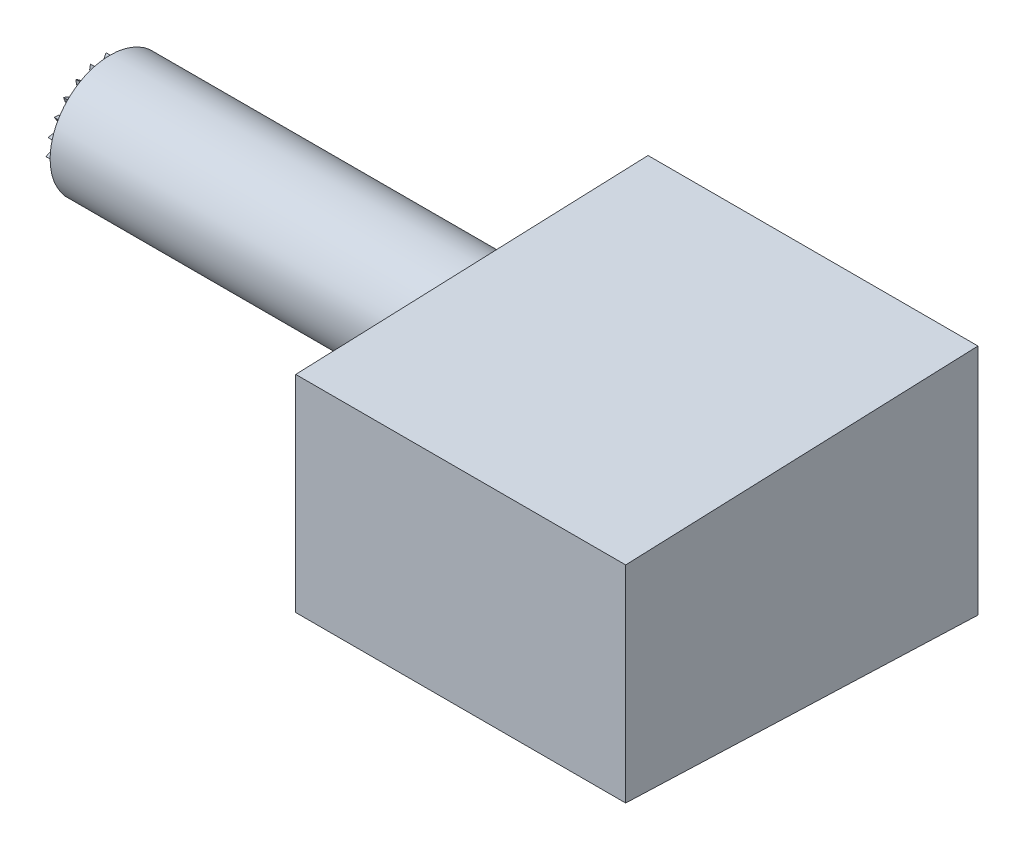
ISO-10303-21;
HEADER;
FILE_DESCRIPTION(('STEP AP214'),'2;1');
FILE_NAME('part.step','',(''),(''),'','','');
FILE_SCHEMA(('AUTOMOTIVE_DESIGN { 1 0 10303 214 1 1 1 1 }'));
ENDSEC;
DATA;
#1=APPLICATION_CONTEXT('core data for automotive mechanical design processes');
#2=APPLICATION_PROTOCOL_DEFINITION('international standard','automotive_design',2000,#1);
#3=PRODUCT_CONTEXT('',#1,'mechanical');
#4=PRODUCT('Part','Part','',(#3));
#5=PRODUCT_RELATED_PRODUCT_CATEGORY('part','',(#4));
#6=PRODUCT_DEFINITION_FORMATION('','',#4);
#7=PRODUCT_DEFINITION_CONTEXT('part definition',#1,'design');
#8=PRODUCT_DEFINITION('design','',#6,#7);
#9=PRODUCT_DEFINITION_SHAPE('','',#8);
#10=(LENGTH_UNIT() NAMED_UNIT(*) SI_UNIT(.MILLI.,.METRE.));
#11=(NAMED_UNIT(*) PLANE_ANGLE_UNIT() SI_UNIT($,.RADIAN.));
#12=(NAMED_UNIT(*) SI_UNIT($,.STERADIAN.) SOLID_ANGLE_UNIT());
#13=UNCERTAINTY_MEASURE_WITH_UNIT(LENGTH_MEASURE(1.E-05),#10,'distance_accuracy_value','');
#14=(GEOMETRIC_REPRESENTATION_CONTEXT(3) GLOBAL_UNCERTAINTY_ASSIGNED_CONTEXT((#13)) GLOBAL_UNIT_ASSIGNED_CONTEXT((#10,
#11,#12)) REPRESENTATION_CONTEXT('',''));
#15=CARTESIAN_POINT('',(0.,0.,0.));
#16=DIRECTION('',(0.,0.,1.));
#17=DIRECTION('',(1.,0.,0.));
#18=AXIS2_PLACEMENT_3D('',#15,#16,#17);
#19=CARTESIAN_POINT('',(0.,-0.0548923524131538,619.584385296464));
#20=DIRECTION('',(0.,8.85954415579071E-05,-0.999999996075424));
#21=DIRECTION('',(0.,0.999999996075424,8.85954415579071E-05));
#22=AXIS2_PLACEMENT_3D('',#19,#20,#21);
#23=PLANE('',#22);
#24=DIRECTION('',(0.,-0.999999996075424,-8.85954415579403E-05));
#25=VECTOR('',#24,1.);
#26=CARTESIAN_POINT('',(15.7387702745492,-8.30004325850316,619.583654813676));
#27=LINE('',#26,#25);
#28=CARTESIAN_POINT('',(15.7387702745492,-8.30004325850316,619.583654813676));
#29=VERTEX_POINT('',#28);
#30=CARTESIAN_POINT('',(15.7387702745492,-28.4000431796192,619.5818740453));
#31=VERTEX_POINT('',#30);
#32=EDGE_CURVE('E79',#29,#31,#27,.T.);
#33=ORIENTED_EDGE('',*,*,#32,.F.);
#34=DIRECTION('',(1.,0.,0.));
#35=VECTOR('',#34,1.);
#36=CARTESIAN_POINT('',(15.7387702745492,-8.30004325850316,619.583654813676));
#37=LINE('',#36,#35);
#38=CARTESIAN_POINT('',(-4.36122972545081,-8.30004325850316,619.583654813676));
#39=VERTEX_POINT('',#38);
#40=EDGE_CURVE('E786',#39,#29,#37,.T.);
#41=ORIENTED_EDGE('',*,*,#40,.F.);
#42=DIRECTION('',(0.,0.999999996075424,8.85954415579403E-05));
#43=VECTOR('',#42,1.);
#44=CARTESIAN_POINT('',(-4.36122972545081,-8.30004325850316,619.583654813676));
#45=LINE('',#44,#43);
#46=CARTESIAN_POINT('',(-4.36122972545081,-28.4000431796192,619.5818740453));
#47=VERTEX_POINT('',#46);
#48=EDGE_CURVE('E795',#47,#39,#45,.T.);
#49=ORIENTED_EDGE('',*,*,#48,.F.);
#50=DIRECTION('',(-1.,0.,0.));
#51=VECTOR('',#50,1.);
#52=CARTESIAN_POINT('',(15.7387702745492,-28.4000431796192,619.5818740453));
#53=LINE('',#52,#51);
#54=EDGE_CURVE('E799',#31,#47,#53,.T.);
#55=ORIENTED_EDGE('',*,*,#54,.F.);
#56=EDGE_LOOP('',(#33,#41,#49,#55));
#57=FACE_BOUND('',#56,.T.);
#58=DIRECTION('',(0.,0.999999996075424,8.85954415579071E-05));
#59=VECTOR('',#58,1.);
#60=CARTESIAN_POINT('',(-34.3112297254508,-68.3459607170805,619.578335019084));
#61=LINE('',#60,#59);
#62=CARTESIAN_POINT('',(-34.3112297254508,-46.6026752505061,619.580261375068));
#63=VERTEX_POINT('',#62);
#64=CARTESIAN_POINT('',(-34.3112297254508,9.9025888123838,619.585267483908));
#65=VERTEX_POINT('',#64);
#66=EDGE_CURVE('E498',#63,#65,#61,.T.);
#67=ORIENTED_EDGE('',*,*,#66,.T.);
#68=DIRECTION('',(1.,0.,0.));
#69=VECTOR('',#68,1.);
#70=CARTESIAN_POINT('',(-74.3112297254508,9.90258881238379,619.585267483908));
#71=LINE('',#70,#69);
#72=CARTESIAN_POINT('',(45.6887702745492,9.90258881238379,619.585267483908));
#73=VERTEX_POINT('',#72);
#74=EDGE_CURVE('E474',#65,#73,#71,.T.);
#75=ORIENTED_EDGE('',*,*,#74,.T.);
#76=DIRECTION('',(0.,-0.999999996075424,-8.85954415579071E-05));
#77=VECTOR('',#76,1.);
#78=CARTESIAN_POINT('',(45.6887702745492,31.6540384980043,619.587194563205));
#79=LINE('',#78,#77);
#80=CARTESIAN_POINT('',(45.6887702745492,-46.6026752505061,619.580261375068));
#81=VERTEX_POINT('',#80);
#82=EDGE_CURVE('E502',#73,#81,#79,.T.);
#83=ORIENTED_EDGE('',*,*,#82,.T.);
#84=DIRECTION('',(1.,0.,0.));
#85=VECTOR('',#84,1.);
#86=CARTESIAN_POINT('',(-74.3112297254508,-46.6026752505061,619.580261375068));
#87=LINE('',#86,#85);
#88=EDGE_CURVE('E485',#63,#81,#87,.T.);
#89=ORIENTED_EDGE('',*,*,#88,.F.);
#90=EDGE_LOOP('',(#67,#75,#83,#89));
#91=FACE_BOUND('',#90,.T.);
#92=ADVANCED_FACE('F61',(#57,#91),#23,.T.);
#93=CARTESIAN_POINT('',(-74.3112297254508,0.,705.));
#94=DIRECTION('',(0.,0.,-1.));
#95=DIRECTION('',(-1.,0.,0.));
#96=AXIS2_PLACEMENT_3D('',#93,#94,#95);
#97=PLANE('',#96);
#98=DIRECTION('',(1.,0.,0.));
#99=VECTOR('',#98,1.);
#100=CARTESIAN_POINT('',(-74.3112297254508,-43.3575154821235,705.));
#101=LINE('',#100,#99);
#102=CARTESIAN_POINT('',(-34.3112297254508,-43.3575154821235,705.));
#103=VERTEX_POINT('',#102);
#104=CARTESIAN_POINT('',(45.6887702745492,-43.3575154821235,705.));
#105=VERTEX_POINT('',#104);
#106=EDGE_CURVE('E487',#103,#105,#101,.T.);
#107=ORIENTED_EDGE('',*,*,#106,.T.);
#108=DIRECTION('',(0.,1.,0.));
#109=VECTOR('',#108,1.);
#110=CARTESIAN_POINT('',(45.6887702745492,0.,705.));
#111=LINE('',#110,#109);
#112=CARTESIAN_POINT('',(45.6887702745492,6.64248451787645,705.));
#113=VERTEX_POINT('',#112);
#114=EDGE_CURVE('E13',#105,#113,#111,.T.);
#115=ORIENTED_EDGE('',*,*,#114,.T.);
#116=DIRECTION('',(1.,0.,0.));
#117=VECTOR('',#116,1.);
#118=CARTESIAN_POINT('',(-74.3112297254508,6.64248451787645,705.));
#119=LINE('',#118,#117);
#120=CARTESIAN_POINT('',(-34.3112297254508,6.64248451787645,705.));
#121=VERTEX_POINT('',#120);
#122=EDGE_CURVE('E492',#121,#113,#119,.T.);
#123=ORIENTED_EDGE('',*,*,#122,.F.);
#124=DIRECTION('',(0.,1.,0.));
#125=VECTOR('',#124,1.);
#126=CARTESIAN_POINT('',(-34.3112297254508,-68.3575154821235,705.));
#127=LINE('',#126,#125);
#128=EDGE_CURVE('E482',#103,#121,#127,.T.);
#129=ORIENTED_EDGE('',*,*,#128,.F.);
#130=EDGE_LOOP('',(#107,#115,#123,#129));
#131=FACE_BOUND('',#130,.T.);
#132=ADVANCED_FACE('F534',(#131),#97,.F.);
#133=CARTESIAN_POINT('',(45.6887702745492,31.6424845178765,750.));
#134=DIRECTION('',(-1.,0.,0.));
#135=DIRECTION('',(0.,0.,1.));
#136=AXIS2_PLACEMENT_3D('',#133,#134,#135);
#137=PLANE('',#136);
#138=ORIENTED_EDGE('',*,*,#82,.F.);
#139=DIRECTION('',(0.,0.0381401679043731,-0.999272399094574));
#140=VECTOR('',#139,1.);
#141=CARTESIAN_POINT('',(45.6887702745492,33.5020759229185,1.27870518789766));
#142=LINE('',#141,#140);
#143=EDGE_CURVE('E71',#113,#73,#142,.T.);
#144=ORIENTED_EDGE('',*,*,#143,.F.);
#145=ORIENTED_EDGE('',*,*,#114,.F.);
#146=DIRECTION('',(0.,-0.0379633617237289,-0.999279131757805));
#147=VECTOR('',#146,1.);
#148=CARTESIAN_POINT('',(45.6887702745492,-70.039904475994,2.66086836421801));
#149=LINE('',#148,#147);
#150=EDGE_CURVE('E491',#105,#81,#149,.T.);
#151=ORIENTED_EDGE('',*,*,#150,.T.);
#152=EDGE_LOOP('',(#138,#144,#145,#151));
#153=FACE_BOUND('',#152,.T.);
#154=ADVANCED_FACE('F532',(#153),#137,.F.);
#155=CARTESIAN_POINT('',(-34.3112297254508,-68.3575154821235,750.));
#156=DIRECTION('',(1.,0.,0.));
#157=DIRECTION('',(0.,1.,0.));
#158=AXIS2_PLACEMENT_3D('',#155,#156,#157);
#159=PLANE('',#158);
#160=ORIENTED_EDGE('',*,*,#66,.F.);
#161=DIRECTION('',(0.,-0.0379633617237289,-0.999279131757805));
#162=VECTOR('',#161,1.);
#163=CARTESIAN_POINT('',(-34.3112297254508,-41.6864261215724,748.986745363951));
#164=LINE('',#163,#162);
#165=EDGE_CURVE('E495',#103,#63,#164,.T.);
#166=ORIENTED_EDGE('',*,*,#165,.F.);
#167=ORIENTED_EDGE('',*,*,#128,.T.);
#168=DIRECTION('',(0.,0.0381401679043731,-0.999272399094574));
#169=VECTOR('',#168,1.);
#170=CARTESIAN_POINT('',(-34.3112297254508,4.81832531852815,752.792971022926));
#171=LINE('',#170,#169);
#172=EDGE_CURVE('E65',#121,#65,#171,.T.);
#173=ORIENTED_EDGE('',*,*,#172,.T.);
#174=EDGE_LOOP('',(#160,#166,#167,#173));
#175=FACE_BOUND('',#174,.T.);
#176=CARTESIAN_POINT('',(-34.3112297254508,-18.3575154821236,650.));
#177=DIRECTION('',(-1.,0.,0.));
#178=DIRECTION('',(0.,-1.,0.));
#179=AXIS2_PLACEMENT_3D('',#176,#177,#178);
#180=CIRCLE('',#179,14.5434368372992);
#181=CARTESIAN_POINT('',(-34.3112297254508,-32.9009523194227,650.));
#182=VERTEX_POINT('',#181);
#183=EDGE_CURVE('E274',#182,#182,#180,.T.);
#184=ORIENTED_EDGE('',*,*,#183,.F.);
#185=EDGE_LOOP('',(#184));
#186=FACE_BOUND('',#185,.T.);
#187=ADVANCED_FACE('F521',(#175,#186),#159,.F.);
#188=CARTESIAN_POINT('',(-74.3112297254508,-70.039904475994,2.66086836421801));
#189=DIRECTION('',(0.,-0.999279131757805,0.0379633617237289));
#190=DIRECTION('',(0.,-0.0379633617237289,-0.999279131757805));
#191=AXIS2_PLACEMENT_3D('',#188,#189,#190);
#192=PLANE('',#191);
#193=ORIENTED_EDGE('',*,*,#165,.T.);
#194=ORIENTED_EDGE('',*,*,#88,.T.);
#195=ORIENTED_EDGE('',*,*,#150,.F.);
#196=ORIENTED_EDGE('',*,*,#106,.F.);
#197=EDGE_LOOP('',(#193,#194,#195,#196));
#198=FACE_BOUND('',#197,.T.);
#199=ADVANCED_FACE('F63',(#198),#192,.T.);
#200=CARTESIAN_POINT('',(-74.3112297254508,33.5020759229185,1.27870518789766));
#201=DIRECTION('',(0.,-0.999272399094574,-0.0381401679043731));
#202=DIRECTION('',(0.,0.0381401679043731,-0.999272399094574));
#203=AXIS2_PLACEMENT_3D('',#200,#201,#202);
#204=PLANE('',#203);
#205=ORIENTED_EDGE('',*,*,#74,.F.);
#206=ORIENTED_EDGE('',*,*,#172,.F.);
#207=ORIENTED_EDGE('',*,*,#122,.T.);
#208=ORIENTED_EDGE('',*,*,#143,.T.);
#209=EDGE_LOOP('',(#205,#206,#207,#208));
#210=FACE_BOUND('',#209,.T.);
#211=ADVANCED_FACE('F527',(#210),#204,.F.);
#212=CARTESIAN_POINT('',(15.7387702745492,-8.30181516733431,639.583654735184));
#213=DIRECTION('',(1.,0.,0.));
#214=DIRECTION('',(0.,0.,-1.));
#215=AXIS2_PLACEMENT_3D('',#212,#213,#214);
#216=PLANE('',#215);
#217=ORIENTED_EDGE('',*,*,#32,.T.);
#218=DIRECTION('',(0.,8.85954415579071E-05,-0.999999996075424));
#219=VECTOR('',#218,1.);
#220=CARTESIAN_POINT('',(15.7387702745492,-28.4018150884503,639.581873966809));
#221=LINE('',#220,#219);
#222=CARTESIAN_POINT('',(15.7387702745492,-28.4018150884503,639.581873966809));
#223=VERTEX_POINT('',#222);
#224=EDGE_CURVE('E821',#223,#31,#221,.T.);
#225=ORIENTED_EDGE('',*,*,#224,.F.);
#226=DIRECTION('',(0.,-0.999999996075424,-8.85954415579403E-05));
#227=VECTOR('',#226,1.);
#228=CARTESIAN_POINT('',(15.7387702745492,-8.30181516733431,639.583654735184));
#229=LINE('',#228,#227);
#230=CARTESIAN_POINT('',(15.7387702745492,-8.30181516733431,639.583654735184));
#231=VERTEX_POINT('',#230);
#232=EDGE_CURVE('E794',#231,#223,#229,.T.);
#233=ORIENTED_EDGE('',*,*,#232,.F.);
#234=DIRECTION('',(0.,8.85954415579071E-05,-0.999999996075424));
#235=VECTOR('',#234,1.);
#236=CARTESIAN_POINT('',(15.7387702745492,-8.30181516733431,639.583654735184));
#237=LINE('',#236,#235);
#238=EDGE_CURVE('E788',#231,#29,#237,.T.);
#239=ORIENTED_EDGE('',*,*,#238,.T.);
#240=EDGE_LOOP('',(#217,#225,#233,#239));
#241=FACE_BOUND('',#240,.T.);
#242=ADVANCED_FACE('F544',(#241),#216,.F.);
#243=CARTESIAN_POINT('',(15.7387702745492,-8.30181516733431,639.583654735184));
#244=DIRECTION('',(0.,0.999999996075424,8.85954415579071E-05));
#245=DIRECTION('',(0.,-8.85954415579071E-05,0.999999996075424));
#246=AXIS2_PLACEMENT_3D('',#243,#244,#245);
#247=PLANE('',#246);
#248=ORIENTED_EDGE('',*,*,#40,.T.);
#249=ORIENTED_EDGE('',*,*,#238,.F.);
#250=DIRECTION('',(1.,0.,0.));
#251=VECTOR('',#250,1.);
#252=CARTESIAN_POINT('',(15.7387702745492,-8.30181516733431,639.583654735184));
#253=LINE('',#252,#251);
#254=CARTESIAN_POINT('',(-4.36122972545081,-8.30181516733431,639.583654735184));
#255=VERTEX_POINT('',#254);
#256=EDGE_CURVE('E808',#255,#231,#253,.T.);
#257=ORIENTED_EDGE('',*,*,#256,.F.);
#258=DIRECTION('',(0.,8.85954415579071E-05,-0.999999996075424));
#259=VECTOR('',#258,1.);
#260=CARTESIAN_POINT('',(-4.36122972545081,-8.30181516733431,639.583654735184));
#261=LINE('',#260,#259);
#262=EDGE_CURVE('E790',#255,#39,#261,.T.);
#263=ORIENTED_EDGE('',*,*,#262,.T.);
#264=EDGE_LOOP('',(#248,#249,#257,#263));
#265=FACE_BOUND('',#264,.T.);
#266=ADVANCED_FACE('F556',(#265),#247,.F.);
#267=CARTESIAN_POINT('',(-4.36122972545081,-8.30181516733431,639.583654735184));
#268=DIRECTION('',(-1.,0.,0.));
#269=DIRECTION('',(0.,0.,1.));
#270=AXIS2_PLACEMENT_3D('',#267,#268,#269);
#271=PLANE('',#270);
#272=ORIENTED_EDGE('',*,*,#48,.T.);
#273=ORIENTED_EDGE('',*,*,#262,.F.);
#274=DIRECTION('',(0.,0.999999996075424,8.85954415579403E-05));
#275=VECTOR('',#274,1.);
#276=CARTESIAN_POINT('',(-4.36122972545081,-8.30181516733431,639.583654735184));
#277=LINE('',#276,#275);
#278=CARTESIAN_POINT('',(-4.36122972545081,-28.4018150884503,639.581873966809));
#279=VERTEX_POINT('',#278);
#280=EDGE_CURVE('E858',#279,#255,#277,.T.);
#281=ORIENTED_EDGE('',*,*,#280,.F.);
#282=DIRECTION('',(0.,8.85954415579071E-05,-0.999999996075424));
#283=VECTOR('',#282,1.);
#284=CARTESIAN_POINT('',(-4.36122972545081,-28.4018150884503,639.581873966809));
#285=LINE('',#284,#283);
#286=EDGE_CURVE('E818',#279,#47,#285,.T.);
#287=ORIENTED_EDGE('',*,*,#286,.T.);
#288=EDGE_LOOP('',(#272,#273,#281,#287));
#289=FACE_BOUND('',#288,.T.);
#290=ADVANCED_FACE('F775',(#289),#271,.F.);
#291=CARTESIAN_POINT('',(15.7387702745492,-28.4018150884503,639.581873966809));
#292=DIRECTION('',(0.,-0.999999996075424,-8.85954415579071E-05));
#293=DIRECTION('',(0.,8.85954415579071E-05,-0.999999996075424));
#294=AXIS2_PLACEMENT_3D('',#291,#292,#293);
#295=PLANE('',#294);
#296=ORIENTED_EDGE('',*,*,#54,.T.);
#297=ORIENTED_EDGE('',*,*,#286,.F.);
#298=DIRECTION('',(-1.,0.,0.));
#299=VECTOR('',#298,1.);
#300=CARTESIAN_POINT('',(15.7387702745492,-28.4018150884503,639.581873966809));
#301=LINE('',#300,#299);
#302=EDGE_CURVE('E861',#223,#279,#301,.T.);
#303=ORIENTED_EDGE('',*,*,#302,.F.);
#304=ORIENTED_EDGE('',*,*,#224,.T.);
#305=EDGE_LOOP('',(#296,#297,#303,#304));
#306=FACE_BOUND('',#305,.T.);
#307=ADVANCED_FACE('F772',(#306),#295,.F.);
#308=CARTESIAN_POINT('',(0.,-0.0566642612461121,639.584385217972));
#309=DIRECTION('',(0.,8.85954415608125E-05,-0.999999996075424));
#310=DIRECTION('',(0.,0.999999996075424,8.85954415608125E-05));
#311=AXIS2_PLACEMENT_3D('',#308,#309,#310);
#312=PLANE('',#311);
#313=ORIENTED_EDGE('',*,*,#232,.T.);
#314=ORIENTED_EDGE('',*,*,#302,.T.);
#315=ORIENTED_EDGE('',*,*,#280,.T.);
#316=ORIENTED_EDGE('',*,*,#256,.T.);
#317=EDGE_LOOP('',(#313,#314,#315,#316));
#318=FACE_BOUND('',#317,.T.);
#319=ADVANCED_FACE('F546',(#318),#312,.T.);
#320=CARTESIAN_POINT('',(-34.3112297254508,-18.3575154821236,650.));
#321=DIRECTION('',(-1.,0.,0.));
#322=DIRECTION('',(0.,-1.,0.));
#323=AXIS2_PLACEMENT_3D('',#320,#321,#322);
#324=CYLINDRICAL_SURFACE('',#323,14.5434368372992);
#325=ORIENTED_EDGE('',*,*,#183,.T.);
#326=EDGE_LOOP('',(#325));
#327=FACE_BOUND('',#326,.T.);
#328=CARTESIAN_POINT('',(-134.311229725451,-18.3575154821236,650.));
#329=DIRECTION('',(-1.,0.,0.));
#330=DIRECTION('',(0.,-1.,0.));
#331=AXIS2_PLACEMENT_3D('',#328,#329,#330);
#332=CIRCLE('',#331,14.5434368372992);
#333=CARTESIAN_POINT('',(-134.311229725451,-18.3575154821236,664.543436837299));
#334=VERTEX_POINT('',#333);
#335=CARTESIAN_POINT('',(-134.311229725451,-14.5933970473849,664.047881244151));
#336=VERTEX_POINT('',#335);
#337=EDGE_CURVE('E258',#334,#336,#332,.T.);
#338=ORIENTED_EDGE('',*,*,#337,.F.);
#339=CARTESIAN_POINT('',(-134.311229725451,-3.8140786448244,650.));
#340=VERTEX_POINT('',#339);
#341=EDGE_CURVE('E275',#340,#334,#332,.T.);
#342=ORIENTED_EDGE('',*,*,#341,.F.);
#343=CARTESIAN_POINT('',(-134.311229725451,-4.30963423797249,653.764118434739));
#344=VERTEX_POINT('',#343);
#345=EDGE_CURVE('E1041',#344,#340,#332,.T.);
#346=ORIENTED_EDGE('',*,*,#345,.F.);
#347=CARTESIAN_POINT('',(-134.311229725451,-5.76252972268804,657.271718418649));
#348=VERTEX_POINT('',#347);
#349=EDGE_CURVE('E1043',#348,#344,#332,.T.);
#350=ORIENTED_EDGE('',*,*,#349,.F.);
#351=CARTESIAN_POINT('',(-134.311229725451,-8.07375267271113,660.283762809412));
#352=VERTEX_POINT('',#351);
#353=EDGE_CURVE('E1046',#352,#348,#332,.T.);
#354=ORIENTED_EDGE('',*,*,#353,.F.);
#355=CARTESIAN_POINT('',(-134.311229725451,-11.085797063474,662.594985759435));
#356=VERTEX_POINT('',#355);
#357=EDGE_CURVE('E261',#356,#352,#332,.T.);
#358=ORIENTED_EDGE('',*,*,#357,.F.);
#359=EDGE_CURVE('E255',#336,#356,#332,.T.);
#360=ORIENTED_EDGE('',*,*,#359,.F.);
#361=EDGE_LOOP('',(#338,#342,#346,#350,#354,#358,#360));
#362=FACE_BOUND('',#361,.T.);
#363=ADVANCED_FACE('F257',(#327,#362),#324,.T.);
#364=CARTESIAN_POINT('',(-135.311229725451,0.,0.));
#365=DIRECTION('',(1.,0.,0.));
#366=DIRECTION('',(0.,0.,-1.));
#367=AXIS2_PLACEMENT_3D('',#364,#365,#366);
#368=PLANE('',#367);
#369=DIRECTION('',(0.,0.904569986548664,0.426325156934646));
#370=VECTOR('',#369,1.);
#371=CARTESIAN_POINT('',(-135.311229725451,-4.87497075010482,649.5));
#372=LINE('',#371,#370);
#373=CARTESIAN_POINT('',(-135.311229725451,-4.87497075010482,649.5));
#374=VERTEX_POINT('',#373);
#375=CARTESIAN_POINT('',(-135.311229725451,-3.81407864482445,650.));
#376=VERTEX_POINT('',#375);
#377=EDGE_CURVE('E448',#374,#376,#372,.T.);
#378=ORIENTED_EDGE('',*,*,#377,.F.);
#379=DIRECTION('',(0.,0.,1.));
#380=VECTOR('',#379,1.);
#381=CARTESIAN_POINT('',(-135.311229725451,-4.87497075010482,649.5));
#382=LINE('',#381,#380);
#383=CARTESIAN_POINT('',(-135.311229725451,-4.87497075010482,650.5));
#384=VERTEX_POINT('',#383);
#385=EDGE_CURVE('E457',#374,#384,#382,.T.);
#386=ORIENTED_EDGE('',*,*,#385,.T.);
#387=DIRECTION('',(0.,-0.9045699865487,0.426325156934568));
#388=VECTOR('',#387,1.);
#389=CARTESIAN_POINT('',(-135.311229725451,-3.81407864482445,650.));
#390=LINE('',#389,#388);
#391=EDGE_CURVE('E452',#376,#384,#390,.T.);
#392=ORIENTED_EDGE('',*,*,#391,.F.);
#393=EDGE_LOOP('',(#378,#386,#392));
#394=FACE_BOUND('',#393,.T.);
#395=ADVANCED_FACE('F600',(#394),#368,.F.);
#396=CARTESIAN_POINT('',(-135.311229725451,0.,0.));
#397=DIRECTION('',(1.,0.,0.));
#398=DIRECTION('',(0.,0.,-1.));
#399=AXIS2_PLACEMENT_3D('',#396,#397,#398);
#400=PLANE('',#399);
#401=DIRECTION('',(0.,0.763406441672316,0.645918419626823));
#402=VECTOR('',#401,1.);
#403=CARTESIAN_POINT('',(-135.311229725451,-5.20496779881777,653.006576439948));
#404=LINE('',#403,#402);
#405=CARTESIAN_POINT('',(-135.311229725451,-5.20496779881777,653.006576439948));
#406=VERTEX_POINT('',#405);
#407=CARTESIAN_POINT('',(-135.311229725451,-4.30963423797251,653.764118434739));
#408=VERTEX_POINT('',#407);
#409=EDGE_CURVE('E431',#406,#408,#404,.T.);
#410=ORIENTED_EDGE('',*,*,#409,.F.);
#411=DIRECTION('',(0.,-0.258819045102499,0.965925826289074));
#412=VECTOR('',#411,1.);
#413=CARTESIAN_POINT('',(-135.311229725451,-5.20496779881777,653.006576439948));
#414=LINE('',#413,#412);
#415=CARTESIAN_POINT('',(-135.311229725451,-5.46378684392027,653.972502266237));
#416=VERTEX_POINT('',#415);
#417=EDGE_CURVE('E418',#406,#416,#414,.T.);
#418=ORIENTED_EDGE('',*,*,#417,.T.);
#419=DIRECTION('',(0.,-0.984088581714332,0.177678539332906));
#420=VECTOR('',#419,1.);
#421=CARTESIAN_POINT('',(-135.311229725451,-4.30963423797251,653.764118434739));
#422=LINE('',#421,#420);
#423=EDGE_CURVE('E441',#408,#416,#422,.T.);
#424=ORIENTED_EDGE('',*,*,#423,.F.);
#425=EDGE_LOOP('',(#410,#418,#424));
#426=FACE_BOUND('',#425,.T.);
#427=ADVANCED_FACE('F741',(#426),#400,.F.);
#428=CARTESIAN_POINT('',(-135.311229725451,0.,0.));
#429=DIRECTION('',(1.,0.,0.));
#430=DIRECTION('',(0.,0.,-1.));
#431=AXIS2_PLACEMENT_3D('',#428,#429,#430);
#432=PLANE('',#431);
#433=DIRECTION('',(0.,0.570218009384797,0.821493409452102));
#434=VECTOR('',#433,1.);
#435=CARTESIAN_POINT('',(-135.311229725451,-6.43128923653538,656.308259664117));
#436=LINE('',#435,#434);
#437=CARTESIAN_POINT('',(-135.311229725451,-6.43128923653538,656.308259664117));
#438=VERTEX_POINT('',#437);
#439=CARTESIAN_POINT('',(-135.311229725451,-5.76252972268823,657.271718418649));
#440=VERTEX_POINT('',#439);
#441=EDGE_CURVE('E397',#438,#440,#436,.T.);
#442=ORIENTED_EDGE('',*,*,#441,.F.);
#443=DIRECTION('',(0.,-0.50000000000004,0.866025403784415));
#444=VECTOR('',#443,1.);
#445=CARTESIAN_POINT('',(-135.311229725451,-6.43128923653538,656.308259664117));
#446=LINE('',#445,#444);
#447=CARTESIAN_POINT('',(-135.311229725451,-6.93128923653544,657.174285067901));
#448=VERTEX_POINT('',#447);
#449=EDGE_CURVE('E384',#438,#448,#446,.T.);
#450=ORIENTED_EDGE('',*,*,#449,.T.);
#451=DIRECTION('',(0.,-0.99654316631941,-0.0830765770965794));
#452=VECTOR('',#451,1.);
#453=CARTESIAN_POINT('',(-135.311229725451,-5.76252972268823,657.271718418649));
#454=LINE('',#453,#452);
#455=EDGE_CURVE('E407',#440,#448,#454,.T.);
#456=ORIENTED_EDGE('',*,*,#455,.F.);
#457=EDGE_LOOP('',(#442,#450,#456));
#458=FACE_BOUND('',#457,.T.);
#459=ADVANCED_FACE('F744',(#458),#432,.F.);
#460=CARTESIAN_POINT('',(-135.311229725451,0.,0.));
#461=DIRECTION('',(1.,0.,0.));
#462=DIRECTION('',(0.,0.,-1.));
#463=AXIS2_PLACEMENT_3D('',#460,#461,#462);
#464=PLANE('',#463);
#465=DIRECTION('',(0.,0.338170162087455,0.941084981005299));
#466=VECTOR('',#465,1.);
#467=CARTESIAN_POINT('',(-135.311229725451,-8.470363283869,659.180045417068));
#468=LINE('',#467,#466);
#469=CARTESIAN_POINT('',(-135.311229725451,-8.470363283869,659.180045417068));
#470=VERTEX_POINT('',#469);
#471=CARTESIAN_POINT('',(-135.311229725451,-8.0737526727113,660.283762809412));
#472=VERTEX_POINT('',#471);
#473=EDGE_CURVE('E363',#470,#472,#468,.T.);
#474=ORIENTED_EDGE('',*,*,#473,.F.);
#475=DIRECTION('',(0.,-0.707106781186548,0.707106781186548));
#476=VECTOR('',#475,1.);
#477=CARTESIAN_POINT('',(-135.311229725451,-8.470363283869,659.180045417068));
#478=LINE('',#477,#476);
#479=CARTESIAN_POINT('',(-135.311229725451,-9.17747006505557,659.887152198255));
#480=VERTEX_POINT('',#479);
#481=EDGE_CURVE('E350',#470,#480,#478,.T.);
#482=ORIENTED_EDGE('',*,*,#481,.T.);
#483=DIRECTION('',(0.,-0.941084981005258,-0.338170162087569));
#484=VECTOR('',#483,1.);
#485=CARTESIAN_POINT('',(-135.311229725451,-8.0737526727113,660.283762809412));
#486=LINE('',#485,#484);
#487=EDGE_CURVE('E373',#472,#480,#486,.T.);
#488=ORIENTED_EDGE('',*,*,#487,.F.);
#489=EDGE_LOOP('',(#474,#482,#488));
#490=FACE_BOUND('',#489,.T.);
#491=ADVANCED_FACE('F749',(#490),#464,.F.);
#492=CARTESIAN_POINT('',(-135.311229725451,0.,0.));
#493=DIRECTION('',(1.,0.,0.));
#494=DIRECTION('',(0.,0.,-1.));
#495=AXIS2_PLACEMENT_3D('',#492,#493,#494);
#496=PLANE('',#495);
#497=DIRECTION('',(0.,0.0830765770965794,0.99654316631941));
#498=VECTOR('',#497,1.);
#499=CARTESIAN_POINT('',(-135.311229725451,-11.1832304142221,661.426226245588));
#500=LINE('',#499,#498);
#501=CARTESIAN_POINT('',(-135.311229725451,-11.1832304142221,661.426226245588));
#502=VERTEX_POINT('',#501);
#503=CARTESIAN_POINT('',(-135.311229725451,-11.0857970634741,662.594985759435));
#504=VERTEX_POINT('',#503);
#505=EDGE_CURVE('E330',#502,#504,#500,.T.);
#506=ORIENTED_EDGE('',*,*,#505,.F.);
#507=DIRECTION('',(0.,-0.866025403784464,0.499999999999957));
#508=VECTOR('',#507,1.);
#509=CARTESIAN_POINT('',(-135.311229725451,-11.1832304142221,661.426226245588));
#510=LINE('',#509,#508);
#511=CARTESIAN_POINT('',(-135.311229725451,-12.0492558180065,661.926226245588));
#512=VERTEX_POINT('',#511);
#513=EDGE_CURVE('E317',#502,#512,#510,.T.);
#514=ORIENTED_EDGE('',*,*,#513,.T.);
#515=DIRECTION('',(0.,-0.821493409452058,-0.570218009384861));
#516=VECTOR('',#515,1.);
#517=CARTESIAN_POINT('',(-135.311229725451,-11.0857970634741,662.594985759435));
#518=LINE('',#517,#516);
#519=EDGE_CURVE('E339',#504,#512,#518,.T.);
#520=ORIENTED_EDGE('',*,*,#519,.F.);
#521=EDGE_LOOP('',(#506,#514,#520));
#522=FACE_BOUND('',#521,.T.);
#523=ADVANCED_FACE('F754',(#522),#496,.F.);
#524=CARTESIAN_POINT('',(-135.311229725451,0.,0.));
#525=DIRECTION('',(1.,0.,0.));
#526=DIRECTION('',(0.,0.,-1.));
#527=AXIS2_PLACEMENT_3D('',#524,#525,#526);
#528=PLANE('',#527);
#529=DIRECTION('',(0.,-0.177678539332929,0.984088581714328));
#530=VECTOR('',#529,1.);
#531=CARTESIAN_POINT('',(-135.311229725451,-14.385013215886,662.893728638203));
#532=LINE('',#531,#530);
#533=CARTESIAN_POINT('',(-135.311229725451,-14.385013215886,662.893728638203));
#534=VERTEX_POINT('',#533);
#535=CARTESIAN_POINT('',(-135.311229725451,-14.593397047385,664.047881244151));
#536=VERTEX_POINT('',#535);
#537=EDGE_CURVE('E290',#534,#536,#532,.T.);
#538=ORIENTED_EDGE('',*,*,#537,.F.);
#539=DIRECTION('',(0.,-0.965925826289072,0.258819045102506));
#540=VECTOR('',#539,1.);
#541=CARTESIAN_POINT('',(-135.311229725451,-14.385013215886,662.893728638203));
#542=LINE('',#541,#540);
#543=CARTESIAN_POINT('',(-135.311229725451,-15.350939042175,663.152547683306));
#544=VERTEX_POINT('',#543);
#545=EDGE_CURVE('E295',#534,#544,#542,.T.);
#546=ORIENTED_EDGE('',*,*,#545,.T.);
#547=DIRECTION('',(0.,-0.645918419626796,-0.763406441672339));
#548=VECTOR('',#547,1.);
#549=CARTESIAN_POINT('',(-135.311229725451,-14.593397047385,664.047881244151));
#550=LINE('',#549,#548);
#551=EDGE_CURVE('E308',#536,#544,#550,.T.);
#552=ORIENTED_EDGE('',*,*,#551,.F.);
#553=EDGE_LOOP('',(#538,#546,#552));
#554=FACE_BOUND('',#553,.T.);
#555=ADVANCED_FACE('F759',(#554),#528,.F.);
#556=CARTESIAN_POINT('',(-135.311229725451,0.,0.));
#557=DIRECTION('',(1.,0.,0.));
#558=DIRECTION('',(0.,0.,-1.));
#559=AXIS2_PLACEMENT_3D('',#556,#557,#558);
#560=PLANE('',#559);
#561=DIRECTION('',(0.,-0.426325156934607,0.904569986548682));
#562=VECTOR('',#561,1.);
#563=CARTESIAN_POINT('',(-135.311229725451,-17.8575154821236,663.482544732018));
#564=LINE('',#563,#562);
#565=CARTESIAN_POINT('',(-135.311229725451,-17.8575154821236,663.482544732018));
#566=VERTEX_POINT('',#565);
#567=CARTESIAN_POINT('',(-135.311229725451,-18.3575154821236,664.543436837299));
#568=VERTEX_POINT('',#567);
#569=EDGE_CURVE('E837',#566,#568,#564,.T.);
#570=ORIENTED_EDGE('',*,*,#569,.F.);
#571=DIRECTION('',(0.,-1.,0.));
#572=VECTOR('',#571,1.);
#573=CARTESIAN_POINT('',(-135.311229725451,-17.8575154821236,663.482544732018));
#574=LINE('',#573,#572);
#575=CARTESIAN_POINT('',(-135.311229725451,-18.8575154821236,663.482544732018));
#576=VERTEX_POINT('',#575);
#577=EDGE_CURVE('E827',#566,#576,#574,.T.);
#578=ORIENTED_EDGE('',*,*,#577,.T.);
#579=DIRECTION('',(0.,-0.426325156934607,-0.904569986548682));
#580=VECTOR('',#579,1.);
#581=CARTESIAN_POINT('',(-135.311229725451,-18.3575154821236,664.543436837299));
#582=LINE('',#581,#580);
#583=EDGE_CURVE('E845',#568,#576,#582,.T.);
#584=ORIENTED_EDGE('',*,*,#583,.F.);
#585=EDGE_LOOP('',(#570,#578,#584));
#586=FACE_BOUND('',#585,.T.);
#587=ADVANCED_FACE('F764',(#586),#560,.F.);
#588=CARTESIAN_POINT('',(-135.311229725451,-17.8575154821236,663.482544732018));
#589=DIRECTION('',(0.,0.,1.));
#590=DIRECTION('',(1.,0.,0.));
#591=AXIS2_PLACEMENT_3D('',#588,#589,#590);
#592=PLANE('',#591);
#593=DIRECTION('',(0.,-1.,0.));
#594=VECTOR('',#593,1.);
#595=CARTESIAN_POINT('',(-134.311229725451,-17.8575154821236,663.482544732018));
#596=LINE('',#595,#594);
#597=CARTESIAN_POINT('',(-134.311229725451,-17.8575154821236,663.482544732018));
#598=VERTEX_POINT('',#597);
#599=CARTESIAN_POINT('',(-134.311229725451,-18.8575154821236,663.482544732018));
#600=VERTEX_POINT('',#599);
#601=EDGE_CURVE('E87',#598,#600,#596,.T.);
#602=ORIENTED_EDGE('',*,*,#601,.T.);
#603=DIRECTION('',(1.,0.,0.));
#604=VECTOR('',#603,1.);
#605=CARTESIAN_POINT('',(-135.311229725451,-18.8575154821236,663.482544732018));
#606=LINE('',#605,#604);
#607=EDGE_CURVE('E828',#576,#600,#606,.T.);
#608=ORIENTED_EDGE('',*,*,#607,.F.);
#609=ORIENTED_EDGE('',*,*,#577,.F.);
#610=DIRECTION('',(1.,0.,0.));
#611=VECTOR('',#610,1.);
#612=CARTESIAN_POINT('',(-135.311229725451,-17.8575154821236,663.482544732018));
#613=LINE('',#612,#611);
#614=EDGE_CURVE('E815',#566,#598,#613,.T.);
#615=ORIENTED_EDGE('',*,*,#614,.T.);
#616=EDGE_LOOP('',(#602,#608,#609,#615));
#617=FACE_BOUND('',#616,.T.);
#618=ADVANCED_FACE('F612',(#617),#592,.F.);
#619=CARTESIAN_POINT('',(-135.311229725451,-18.3575154821236,664.543436837299));
#620=DIRECTION('',(0.,-0.904569986548682,0.426325156934607));
#621=DIRECTION('',(0.,-0.426325156934607,-0.904569986548682));
#622=AXIS2_PLACEMENT_3D('',#619,#620,#621);
#623=PLANE('',#622);
#624=DIRECTION('',(0.,-0.426325156934607,-0.904569986548682));
#625=VECTOR('',#624,1.);
#626=CARTESIAN_POINT('',(-134.311229725451,-18.3575154821236,664.543436837299));
#627=LINE('',#626,#625);
#628=EDGE_CURVE('E836',#334,#600,#627,.T.);
#629=ORIENTED_EDGE('',*,*,#628,.F.);
#630=DIRECTION('',(1.,0.,0.));
#631=VECTOR('',#630,1.);
#632=CARTESIAN_POINT('',(-135.311229725451,-18.3575154821236,664.543436837299));
#633=LINE('',#632,#631);
#634=EDGE_CURVE('E824',#568,#334,#633,.T.);
#635=ORIENTED_EDGE('',*,*,#634,.F.);
#636=ORIENTED_EDGE('',*,*,#583,.T.);
#637=ORIENTED_EDGE('',*,*,#607,.T.);
#638=EDGE_LOOP('',(#629,#635,#636,#637));
#639=FACE_BOUND('',#638,.T.);
#640=ADVANCED_FACE('F607',(#639),#623,.T.);
#641=CARTESIAN_POINT('',(-135.311229725451,-4.87497075010482,649.5));
#642=DIRECTION('',(0.,0.426325156934646,-0.904569986548664));
#643=DIRECTION('',(0.,0.904569986548664,0.426325156934646));
#644=AXIS2_PLACEMENT_3D('',#641,#642,#643);
#645=PLANE('',#644);
#646=DIRECTION('',(0.,0.904569986548664,0.426325156934646));
#647=VECTOR('',#646,1.);
#648=CARTESIAN_POINT('',(-134.311229725451,-4.87497075010482,649.5));
#649=LINE('',#648,#647);
#650=CARTESIAN_POINT('',(-134.311229725451,-4.87497075010482,649.5));
#651=VERTEX_POINT('',#650);
#652=EDGE_CURVE('E438',#651,#340,#649,.T.);
#653=ORIENTED_EDGE('',*,*,#652,.F.);
#654=DIRECTION('',(1.,0.,0.));
#655=VECTOR('',#654,1.);
#656=CARTESIAN_POINT('',(-135.311229725451,-4.87497075010482,649.5));
#657=LINE('',#656,#655);
#658=EDGE_CURVE('E470',#374,#651,#657,.T.);
#659=ORIENTED_EDGE('',*,*,#658,.F.);
#660=ORIENTED_EDGE('',*,*,#377,.T.);
#661=DIRECTION('',(1.,0.,0.));
#662=VECTOR('',#661,1.);
#663=CARTESIAN_POINT('',(-135.311229725451,-3.81407864482445,650.));
#664=LINE('',#663,#662);
#665=EDGE_CURVE('E460',#376,#340,#664,.T.);
#666=ORIENTED_EDGE('',*,*,#665,.T.);
#667=EDGE_LOOP('',(#653,#659,#660,#666));
#668=FACE_BOUND('',#667,.T.);
#669=ADVANCED_FACE('F611',(#668),#645,.T.);
#670=CARTESIAN_POINT('',(-135.311229725451,-4.87497075010482,649.5));
#671=DIRECTION('',(0.,1.,0.));
#672=DIRECTION('',(-1.,0.,0.));
#673=AXIS2_PLACEMENT_3D('',#670,#671,#672);
#674=PLANE('',#673);
#675=DIRECTION('',(0.,0.,1.));
#676=VECTOR('',#675,1.);
#677=CARTESIAN_POINT('',(-134.311229725451,-4.87497075010482,649.5));
#678=LINE('',#677,#676);
#679=CARTESIAN_POINT('',(-134.311229725451,-4.87497075010482,650.5));
#680=VERTEX_POINT('',#679);
#681=EDGE_CURVE('E453',#651,#680,#678,.T.);
#682=ORIENTED_EDGE('',*,*,#681,.T.);
#683=DIRECTION('',(1.,0.,0.));
#684=VECTOR('',#683,1.);
#685=CARTESIAN_POINT('',(-135.311229725451,-4.87497075010482,650.5));
#686=LINE('',#685,#684);
#687=EDGE_CURVE('E475',#384,#680,#686,.T.);
#688=ORIENTED_EDGE('',*,*,#687,.F.);
#689=ORIENTED_EDGE('',*,*,#385,.F.);
#690=ORIENTED_EDGE('',*,*,#658,.T.);
#691=EDGE_LOOP('',(#682,#688,#689,#690));
#692=FACE_BOUND('',#691,.T.);
#693=ADVANCED_FACE('F622',(#692),#674,.F.);
#694=CARTESIAN_POINT('',(-135.311229725451,-3.81407864482445,650.));
#695=DIRECTION('',(0.,0.426325156934568,0.9045699865487));
#696=DIRECTION('',(0.,-0.9045699865487,0.426325156934568));
#697=AXIS2_PLACEMENT_3D('',#694,#695,#696);
#698=PLANE('',#697);
#699=DIRECTION('',(0.,-0.9045699865487,0.426325156934568));
#700=VECTOR('',#699,1.);
#701=CARTESIAN_POINT('',(-134.311229725451,-3.81407864482445,650.));
#702=LINE('',#701,#700);
#703=EDGE_CURVE('E464',#340,#680,#702,.T.);
#704=ORIENTED_EDGE('',*,*,#703,.F.);
#705=ORIENTED_EDGE('',*,*,#665,.F.);
#706=ORIENTED_EDGE('',*,*,#391,.T.);
#707=ORIENTED_EDGE('',*,*,#687,.T.);
#708=EDGE_LOOP('',(#704,#705,#706,#707));
#709=FACE_BOUND('',#708,.T.);
#710=ADVANCED_FACE('F629',(#709),#698,.T.);
#711=CARTESIAN_POINT('',(-135.311229725451,-5.20496779881777,653.006576439948));
#712=DIRECTION('',(0.,0.645918419626823,-0.763406441672316));
#713=DIRECTION('',(0.,0.763406441672316,0.645918419626823));
#714=AXIS2_PLACEMENT_3D('',#711,#712,#713);
#715=PLANE('',#714);
#716=DIRECTION('',(0.,0.763406441672316,0.645918419626823));
#717=VECTOR('',#716,1.);
#718=CARTESIAN_POINT('',(-134.311229725451,-5.20496779881777,653.006576439948));
#719=LINE('',#718,#717);
#720=CARTESIAN_POINT('',(-134.311229725451,-5.20496779881776,653.006576439948));
#721=VERTEX_POINT('',#720);
#722=EDGE_CURVE('E434',#721,#344,#719,.T.);
#723=ORIENTED_EDGE('',*,*,#722,.F.);
#724=DIRECTION('',(1.,0.,0.));
#725=VECTOR('',#724,1.);
#726=CARTESIAN_POINT('',(-135.311229725451,-5.20496779881777,653.006576439948));
#727=LINE('',#726,#725);
#728=EDGE_CURVE('E404',#406,#721,#727,.T.);
#729=ORIENTED_EDGE('',*,*,#728,.F.);
#730=ORIENTED_EDGE('',*,*,#409,.T.);
#731=DIRECTION('',(1.,0.,0.));
#732=VECTOR('',#731,1.);
#733=CARTESIAN_POINT('',(-135.311229725451,-4.30963423797251,653.764118434739));
#734=LINE('',#733,#732);
#735=EDGE_CURVE('E414',#408,#344,#734,.T.);
#736=ORIENTED_EDGE('',*,*,#735,.T.);
#737=EDGE_LOOP('',(#723,#729,#730,#736));
#738=FACE_BOUND('',#737,.T.);
#739=ADVANCED_FACE('F633',(#738),#715,.T.);
#740=CARTESIAN_POINT('',(-135.311229725451,-5.20496779881777,653.006576439948));
#741=DIRECTION('',(0.,0.965925826289074,0.258819045102499));
#742=DIRECTION('',(0.,-0.258819045102499,0.965925826289074));
#743=AXIS2_PLACEMENT_3D('',#740,#741,#742);
#744=PLANE('',#743);
#745=DIRECTION('',(0.,-0.258819045102499,0.965925826289074));
#746=VECTOR('',#745,1.);
#747=CARTESIAN_POINT('',(-134.311229725451,-5.20496779881777,653.006576439948));
#748=LINE('',#747,#746);
#749=CARTESIAN_POINT('',(-134.311229725451,-5.46378684392027,653.972502266237));
#750=VERTEX_POINT('',#749);
#751=EDGE_CURVE('E426',#721,#750,#748,.T.);
#752=ORIENTED_EDGE('',*,*,#751,.T.);
#753=DIRECTION('',(1.,0.,0.));
#754=VECTOR('',#753,1.);
#755=CARTESIAN_POINT('',(-135.311229725451,-5.46378684392027,653.972502266237));
#756=LINE('',#755,#754);
#757=EDGE_CURVE('E419',#416,#750,#756,.T.);
#758=ORIENTED_EDGE('',*,*,#757,.F.);
#759=ORIENTED_EDGE('',*,*,#417,.F.);
#760=ORIENTED_EDGE('',*,*,#728,.T.);
#761=EDGE_LOOP('',(#752,#758,#759,#760));
#762=FACE_BOUND('',#761,.T.);
#763=ADVANCED_FACE('F642',(#762),#744,.F.);
#764=CARTESIAN_POINT('',(-135.311229725451,-4.30963423797251,653.764118434739));
#765=DIRECTION('',(0.,0.177678539332906,0.984088581714332));
#766=DIRECTION('',(0.,-0.984088581714332,0.177678539332906));
#767=AXIS2_PLACEMENT_3D('',#764,#765,#766);
#768=PLANE('',#767);
#769=DIRECTION('',(0.,-0.984088581714332,0.177678539332906));
#770=VECTOR('',#769,1.);
#771=CARTESIAN_POINT('',(-134.311229725451,-4.30963423797251,653.764118434739));
#772=LINE('',#771,#770);
#773=EDGE_CURVE('E430',#344,#750,#772,.T.);
#774=ORIENTED_EDGE('',*,*,#773,.F.);
#775=ORIENTED_EDGE('',*,*,#735,.F.);
#776=ORIENTED_EDGE('',*,*,#423,.T.);
#777=ORIENTED_EDGE('',*,*,#757,.T.);
#778=EDGE_LOOP('',(#774,#775,#776,#777));
#779=FACE_BOUND('',#778,.T.);
#780=ADVANCED_FACE('F648',(#779),#768,.T.);
#781=CARTESIAN_POINT('',(-135.311229725451,-6.43128923653538,656.308259664117));
#782=DIRECTION('',(0.,0.821493409452102,-0.570218009384797));
#783=DIRECTION('',(0.,0.570218009384797,0.821493409452102));
#784=AXIS2_PLACEMENT_3D('',#781,#782,#783);
#785=PLANE('',#784);
#786=DIRECTION('',(0.,0.570218009384797,0.821493409452102));
#787=VECTOR('',#786,1.);
#788=CARTESIAN_POINT('',(-134.311229725451,-6.43128923653538,656.308259664117));
#789=LINE('',#788,#787);
#790=CARTESIAN_POINT('',(-134.311229725451,-6.43128923653536,656.308259664117));
#791=VERTEX_POINT('',#790);
#792=EDGE_CURVE('E400',#791,#348,#789,.T.);
#793=ORIENTED_EDGE('',*,*,#792,.F.);
#794=DIRECTION('',(1.,0.,0.));
#795=VECTOR('',#794,1.);
#796=CARTESIAN_POINT('',(-135.311229725451,-6.43128923653538,656.308259664117));
#797=LINE('',#796,#795);
#798=EDGE_CURVE('E370',#438,#791,#797,.T.);
#799=ORIENTED_EDGE('',*,*,#798,.F.);
#800=ORIENTED_EDGE('',*,*,#441,.T.);
#801=DIRECTION('',(1.,0.,0.));
#802=VECTOR('',#801,1.);
#803=CARTESIAN_POINT('',(-135.311229725451,-5.76252972268823,657.271718418649));
#804=LINE('',#803,#802);
#805=EDGE_CURVE('E380',#440,#348,#804,.T.);
#806=ORIENTED_EDGE('',*,*,#805,.T.);
#807=EDGE_LOOP('',(#793,#799,#800,#806));
#808=FACE_BOUND('',#807,.T.);
#809=ADVANCED_FACE('F652',(#808),#785,.T.);
#810=CARTESIAN_POINT('',(-135.311229725451,-6.43128923653538,656.308259664117));
#811=DIRECTION('',(0.,0.866025403784416,0.50000000000004));
#812=DIRECTION('',(0.,-0.50000000000004,0.866025403784415));
#813=AXIS2_PLACEMENT_3D('',#810,#811,#812);
#814=PLANE('',#813);
#815=DIRECTION('',(0.,-0.50000000000004,0.866025403784415));
#816=VECTOR('',#815,1.);
#817=CARTESIAN_POINT('',(-134.311229725451,-6.43128923653538,656.308259664117));
#818=LINE('',#817,#816);
#819=CARTESIAN_POINT('',(-134.311229725451,-6.93128923653544,657.174285067901));
#820=VERTEX_POINT('',#819);
#821=EDGE_CURVE('E392',#791,#820,#818,.T.);
#822=ORIENTED_EDGE('',*,*,#821,.T.);
#823=DIRECTION('',(1.,0.,0.));
#824=VECTOR('',#823,1.);
#825=CARTESIAN_POINT('',(-135.311229725451,-6.93128923653544,657.174285067901));
#826=LINE('',#825,#824);
#827=EDGE_CURVE('E385',#448,#820,#826,.T.);
#828=ORIENTED_EDGE('',*,*,#827,.F.);
#829=ORIENTED_EDGE('',*,*,#449,.F.);
#830=ORIENTED_EDGE('',*,*,#798,.T.);
#831=EDGE_LOOP('',(#822,#828,#829,#830));
#832=FACE_BOUND('',#831,.T.);
#833=ADVANCED_FACE('F661',(#832),#814,.F.);
#834=CARTESIAN_POINT('',(-135.311229725451,-5.76252972268823,657.271718418649));
#835=DIRECTION('',(0.,-0.0830765770965794,0.99654316631941));
#836=DIRECTION('',(0.,-0.99654316631941,-0.0830765770965794));
#837=AXIS2_PLACEMENT_3D('',#834,#835,#836);
#838=PLANE('',#837);
#839=DIRECTION('',(0.,-0.99654316631941,-0.0830765770965794));
#840=VECTOR('',#839,1.);
#841=CARTESIAN_POINT('',(-134.311229725451,-5.76252972268823,657.271718418649));
#842=LINE('',#841,#840);
#843=EDGE_CURVE('E396',#348,#820,#842,.T.);
#844=ORIENTED_EDGE('',*,*,#843,.F.);
#845=ORIENTED_EDGE('',*,*,#805,.F.);
#846=ORIENTED_EDGE('',*,*,#455,.T.);
#847=ORIENTED_EDGE('',*,*,#827,.T.);
#848=EDGE_LOOP('',(#844,#845,#846,#847));
#849=FACE_BOUND('',#848,.T.);
#850=ADVANCED_FACE('F667',(#849),#838,.T.);
#851=CARTESIAN_POINT('',(-135.311229725451,-8.470363283869,659.180045417068));
#852=DIRECTION('',(0.,0.941084981005299,-0.338170162087455));
#853=DIRECTION('',(0.,0.338170162087455,0.941084981005299));
#854=AXIS2_PLACEMENT_3D('',#851,#852,#853);
#855=PLANE('',#854);
#856=DIRECTION('',(0.,0.338170162087455,0.941084981005299));
#857=VECTOR('',#856,1.);
#858=CARTESIAN_POINT('',(-134.311229725451,-8.470363283869,659.180045417068));
#859=LINE('',#858,#857);
#860=CARTESIAN_POINT('',(-134.311229725451,-8.470363283869,659.180045417068));
#861=VERTEX_POINT('',#860);
#862=EDGE_CURVE('E366',#861,#352,#859,.T.);
#863=ORIENTED_EDGE('',*,*,#862,.F.);
#864=DIRECTION('',(1.,0.,0.));
#865=VECTOR('',#864,1.);
#866=CARTESIAN_POINT('',(-135.311229725451,-8.470363283869,659.180045417068));
#867=LINE('',#866,#865);
#868=EDGE_CURVE('E336',#470,#861,#867,.T.);
#869=ORIENTED_EDGE('',*,*,#868,.F.);
#870=ORIENTED_EDGE('',*,*,#473,.T.);
#871=DIRECTION('',(1.,0.,0.));
#872=VECTOR('',#871,1.);
#873=CARTESIAN_POINT('',(-135.311229725451,-8.0737526727113,660.283762809412));
#874=LINE('',#873,#872);
#875=EDGE_CURVE('E346',#472,#352,#874,.T.);
#876=ORIENTED_EDGE('',*,*,#875,.T.);
#877=EDGE_LOOP('',(#863,#869,#870,#876));
#878=FACE_BOUND('',#877,.T.);
#879=ADVANCED_FACE('F671',(#878),#855,.T.);
#880=CARTESIAN_POINT('',(-135.311229725451,-8.470363283869,659.180045417068));
#881=DIRECTION('',(0.,0.707106781186547,0.707106781186547));
#882=DIRECTION('',(0.,-0.707106781186548,0.707106781186548));
#883=AXIS2_PLACEMENT_3D('',#880,#881,#882);
#884=PLANE('',#883);
#885=DIRECTION('',(0.,-0.707106781186548,0.707106781186548));
#886=VECTOR('',#885,1.);
#887=CARTESIAN_POINT('',(-134.311229725451,-8.470363283869,659.180045417068));
#888=LINE('',#887,#886);
#889=CARTESIAN_POINT('',(-134.311229725451,-9.17747006505557,659.887152198255));
#890=VERTEX_POINT('',#889);
#891=EDGE_CURVE('E358',#861,#890,#888,.T.);
#892=ORIENTED_EDGE('',*,*,#891,.T.);
#893=DIRECTION('',(1.,0.,0.));
#894=VECTOR('',#893,1.);
#895=CARTESIAN_POINT('',(-135.311229725451,-9.17747006505557,659.887152198255));
#896=LINE('',#895,#894);
#897=EDGE_CURVE('E351',#480,#890,#896,.T.);
#898=ORIENTED_EDGE('',*,*,#897,.F.);
#899=ORIENTED_EDGE('',*,*,#481,.F.);
#900=ORIENTED_EDGE('',*,*,#868,.T.);
#901=EDGE_LOOP('',(#892,#898,#899,#900));
#902=FACE_BOUND('',#901,.T.);
#903=ADVANCED_FACE('F680',(#902),#884,.F.);
#904=CARTESIAN_POINT('',(-135.311229725451,-8.0737526727113,660.283762809412));
#905=DIRECTION('',(0.,-0.338170162087569,0.941084981005258));
#906=DIRECTION('',(0.,-0.941084981005258,-0.338170162087569));
#907=AXIS2_PLACEMENT_3D('',#904,#905,#906);
#908=PLANE('',#907);
#909=DIRECTION('',(0.,-0.941084981005258,-0.338170162087569));
#910=VECTOR('',#909,1.);
#911=CARTESIAN_POINT('',(-134.311229725451,-8.0737526727113,660.283762809412));
#912=LINE('',#911,#910);
#913=EDGE_CURVE('E362',#352,#890,#912,.T.);
#914=ORIENTED_EDGE('',*,*,#913,.F.);
#915=ORIENTED_EDGE('',*,*,#875,.F.);
#916=ORIENTED_EDGE('',*,*,#487,.T.);
#917=ORIENTED_EDGE('',*,*,#897,.T.);
#918=EDGE_LOOP('',(#914,#915,#916,#917));
#919=FACE_BOUND('',#918,.T.);
#920=ADVANCED_FACE('F686',(#919),#908,.T.);
#921=CARTESIAN_POINT('',(-135.311229725451,-11.1832304142221,661.426226245588));
#922=DIRECTION('',(0.,0.99654316631941,-0.0830765770965794));
#923=DIRECTION('',(0.,0.0830765770965794,0.99654316631941));
#924=AXIS2_PLACEMENT_3D('',#921,#922,#923);
#925=PLANE('',#924);
#926=DIRECTION('',(0.,0.0830765770965794,0.99654316631941));
#927=VECTOR('',#926,1.);
#928=CARTESIAN_POINT('',(-134.311229725451,-11.1832304142221,661.426226245588));
#929=LINE('',#928,#927);
#930=CARTESIAN_POINT('',(-134.311229725451,-11.1832304142221,661.426226245588));
#931=VERTEX_POINT('',#930);
#932=EDGE_CURVE('E333',#931,#356,#929,.T.);
#933=ORIENTED_EDGE('',*,*,#932,.F.);
#934=DIRECTION('',(1.,0.,0.));
#935=VECTOR('',#934,1.);
#936=CARTESIAN_POINT('',(-135.311229725451,-11.1832304142221,661.426226245588));
#937=LINE('',#936,#935);
#938=EDGE_CURVE('E284',#502,#931,#937,.T.);
#939=ORIENTED_EDGE('',*,*,#938,.F.);
#940=ORIENTED_EDGE('',*,*,#505,.T.);
#941=DIRECTION('',(1.,0.,0.));
#942=VECTOR('',#941,1.);
#943=CARTESIAN_POINT('',(-135.311229725451,-11.0857970634741,662.594985759435));
#944=LINE('',#943,#942);
#945=EDGE_CURVE('E313',#504,#356,#944,.T.);
#946=ORIENTED_EDGE('',*,*,#945,.T.);
#947=EDGE_LOOP('',(#933,#939,#940,#946));
#948=FACE_BOUND('',#947,.T.);
#949=ADVANCED_FACE('F690',(#948),#925,.T.);
#950=CARTESIAN_POINT('',(-135.311229725451,-11.1832304142221,661.426226245588));
#951=DIRECTION('',(0.,0.499999999999957,0.866025403784464));
#952=DIRECTION('',(0.,-0.866025403784464,0.499999999999957));
#953=AXIS2_PLACEMENT_3D('',#950,#951,#952);
#954=PLANE('',#953);
#955=DIRECTION('',(0.,-0.866025403784464,0.499999999999957));
#956=VECTOR('',#955,1.);
#957=CARTESIAN_POINT('',(-134.311229725451,-11.1832304142221,661.426226245588));
#958=LINE('',#957,#956);
#959=CARTESIAN_POINT('',(-134.311229725451,-12.0492558180065,661.926226245588));
#960=VERTEX_POINT('',#959);
#961=EDGE_CURVE('E325',#931,#960,#958,.T.);
#962=ORIENTED_EDGE('',*,*,#961,.T.);
#963=DIRECTION('',(1.,0.,0.));
#964=VECTOR('',#963,1.);
#965=CARTESIAN_POINT('',(-135.311229725451,-12.0492558180065,661.926226245588));
#966=LINE('',#965,#964);
#967=EDGE_CURVE('E318',#512,#960,#966,.T.);
#968=ORIENTED_EDGE('',*,*,#967,.F.);
#969=ORIENTED_EDGE('',*,*,#513,.F.);
#970=ORIENTED_EDGE('',*,*,#938,.T.);
#971=EDGE_LOOP('',(#962,#968,#969,#970));
#972=FACE_BOUND('',#971,.T.);
#973=ADVANCED_FACE('F699',(#972),#954,.F.);
#974=CARTESIAN_POINT('',(-135.311229725451,-11.0857970634741,662.594985759435));
#975=DIRECTION('',(0.,-0.570218009384861,0.821493409452058));
#976=DIRECTION('',(0.,-0.821493409452058,-0.570218009384861));
#977=AXIS2_PLACEMENT_3D('',#974,#975,#976);
#978=PLANE('',#977);
#979=DIRECTION('',(0.,-0.821493409452058,-0.570218009384861));
#980=VECTOR('',#979,1.);
#981=CARTESIAN_POINT('',(-134.311229725451,-11.0857970634741,662.594985759435));
#982=LINE('',#981,#980);
#983=EDGE_CURVE('E329',#356,#960,#982,.T.);
#984=ORIENTED_EDGE('',*,*,#983,.F.);
#985=ORIENTED_EDGE('',*,*,#945,.F.);
#986=ORIENTED_EDGE('',*,*,#519,.T.);
#987=ORIENTED_EDGE('',*,*,#967,.T.);
#988=EDGE_LOOP('',(#984,#985,#986,#987));
#989=FACE_BOUND('',#988,.T.);
#990=ADVANCED_FACE('F705',(#989),#978,.T.);
#991=CARTESIAN_POINT('',(-135.311229725451,-14.385013215886,662.893728638203));
#992=DIRECTION('',(0.,0.984088581714328,0.177678539332929));
#993=DIRECTION('',(0.,-0.177678539332929,0.984088581714328));
#994=AXIS2_PLACEMENT_3D('',#991,#992,#993);
#995=PLANE('',#994);
#996=DIRECTION('',(0.,-0.177678539332929,0.984088581714328));
#997=VECTOR('',#996,1.);
#998=CARTESIAN_POINT('',(-134.311229725451,-14.385013215886,662.893728638203));
#999=LINE('',#998,#997);
#1000=CARTESIAN_POINT('',(-134.311229725451,-14.385013215886,662.893728638203));
#1001=VERTEX_POINT('',#1000);
#1002=EDGE_CURVE('E277',#1001,#336,#999,.T.);
#1003=ORIENTED_EDGE('',*,*,#1002,.F.);
#1004=DIRECTION('',(1.,0.,0.));
#1005=VECTOR('',#1004,1.);
#1006=CARTESIAN_POINT('',(-135.311229725451,-14.385013215886,662.893728638203));
#1007=LINE('',#1006,#1005);
#1008=EDGE_CURVE('E842',#534,#1001,#1007,.T.);
#1009=ORIENTED_EDGE('',*,*,#1008,.F.);
#1010=ORIENTED_EDGE('',*,*,#537,.T.);
#1011=DIRECTION('',(1.,0.,0.));
#1012=VECTOR('',#1011,1.);
#1013=CARTESIAN_POINT('',(-135.311229725451,-14.593397047385,664.047881244151));
#1014=LINE('',#1013,#1012);
#1015=EDGE_CURVE('E287',#536,#336,#1014,.T.);
#1016=ORIENTED_EDGE('',*,*,#1015,.T.);
#1017=EDGE_LOOP('',(#1003,#1009,#1010,#1016));
#1018=FACE_BOUND('',#1017,.T.);
#1019=ADVANCED_FACE('F288',(#1018),#995,.T.);
#1020=CARTESIAN_POINT('',(-135.311229725451,-14.385013215886,662.893728638203));
#1021=DIRECTION('',(0.,0.258819045102506,0.965925826289072));
#1022=DIRECTION('',(0.,-0.965925826289072,0.258819045102506));
#1023=AXIS2_PLACEMENT_3D('',#1020,#1021,#1022);
#1024=PLANE('',#1023);
#1025=DIRECTION('',(0.,-0.965925826289072,0.258819045102506));
#1026=VECTOR('',#1025,1.);
#1027=CARTESIAN_POINT('',(-134.311229725451,-14.385013215886,662.893728638203));
#1028=LINE('',#1027,#1026);
#1029=CARTESIAN_POINT('',(-134.311229725451,-15.3509390421751,663.152547683306));
#1030=VERTEX_POINT('',#1029);
#1031=EDGE_CURVE('E280',#1001,#1030,#1028,.T.);
#1032=ORIENTED_EDGE('',*,*,#1031,.T.);
#1033=DIRECTION('',(1.,0.,0.));
#1034=VECTOR('',#1033,1.);
#1035=CARTESIAN_POINT('',(-135.311229725451,-15.350939042175,663.152547683306));
#1036=LINE('',#1035,#1034);
#1037=EDGE_CURVE('E296',#544,#1030,#1036,.T.);
#1038=ORIENTED_EDGE('',*,*,#1037,.F.);
#1039=ORIENTED_EDGE('',*,*,#545,.F.);
#1040=ORIENTED_EDGE('',*,*,#1008,.T.);
#1041=EDGE_LOOP('',(#1032,#1038,#1039,#1040));
#1042=FACE_BOUND('',#1041,.T.);
#1043=ADVANCED_FACE('F717',(#1042),#1024,.F.);
#1044=CARTESIAN_POINT('',(-135.311229725451,-14.593397047385,664.047881244151));
#1045=DIRECTION('',(0.,-0.763406441672339,0.645918419626796));
#1046=DIRECTION('',(0.,-0.645918419626796,-0.763406441672339));
#1047=AXIS2_PLACEMENT_3D('',#1044,#1045,#1046);
#1048=PLANE('',#1047);
#1049=DIRECTION('',(0.,-0.645918419626796,-0.763406441672339));
#1050=VECTOR('',#1049,1.);
#1051=CARTESIAN_POINT('',(-134.311229725451,-14.593397047385,664.047881244151));
#1052=LINE('',#1051,#1050);
#1053=EDGE_CURVE('E268',#336,#1030,#1052,.T.);
#1054=ORIENTED_EDGE('',*,*,#1053,.F.);
#1055=ORIENTED_EDGE('',*,*,#1015,.F.);
#1056=ORIENTED_EDGE('',*,*,#551,.T.);
#1057=ORIENTED_EDGE('',*,*,#1037,.T.);
#1058=EDGE_LOOP('',(#1054,#1055,#1056,#1057));
#1059=FACE_BOUND('',#1058,.T.);
#1060=ADVANCED_FACE('F298',(#1059),#1048,.T.);
#1061=CARTESIAN_POINT('',(-135.311229725451,-17.8575154821236,663.482544732018));
#1062=DIRECTION('',(0.,0.904569986548682,0.426325156934607));
#1063=DIRECTION('',(0.,-0.426325156934607,0.904569986548682));
#1064=AXIS2_PLACEMENT_3D('',#1061,#1062,#1063);
#1065=PLANE('',#1064);
#1066=DIRECTION('',(0.,-0.426325156934607,0.904569986548682));
#1067=VECTOR('',#1066,1.);
#1068=CARTESIAN_POINT('',(-134.311229725451,-17.8575154821236,663.482544732018));
#1069=LINE('',#1068,#1067);
#1070=EDGE_CURVE('E271',#598,#334,#1069,.T.);
#1071=ORIENTED_EDGE('',*,*,#1070,.F.);
#1072=ORIENTED_EDGE('',*,*,#614,.F.);
#1073=ORIENTED_EDGE('',*,*,#569,.T.);
#1074=ORIENTED_EDGE('',*,*,#634,.T.);
#1075=EDGE_LOOP('',(#1071,#1072,#1073,#1074));
#1076=FACE_BOUND('',#1075,.T.);
#1077=ADVANCED_FACE('F725',(#1076),#1065,.T.);
#1078=CARTESIAN_POINT('',(-134.311229725451,-18.3575154821236,650.));
#1079=DIRECTION('',(-1.,0.,0.));
#1080=DIRECTION('',(0.,-1.,0.));
#1081=AXIS2_PLACEMENT_3D('',#1078,#1079,#1080);
#1082=PLANE('',#1081);
#1083=ORIENTED_EDGE('',*,*,#1070,.T.);
#1084=ORIENTED_EDGE('',*,*,#337,.T.);
#1085=ORIENTED_EDGE('',*,*,#1053,.T.);
#1086=ORIENTED_EDGE('',*,*,#1031,.F.);
#1087=ORIENTED_EDGE('',*,*,#1002,.T.);
#1088=ORIENTED_EDGE('',*,*,#359,.T.);
#1089=ORIENTED_EDGE('',*,*,#983,.T.);
#1090=ORIENTED_EDGE('',*,*,#961,.F.);
#1091=ORIENTED_EDGE('',*,*,#932,.T.);
#1092=ORIENTED_EDGE('',*,*,#357,.T.);
#1093=ORIENTED_EDGE('',*,*,#913,.T.);
#1094=ORIENTED_EDGE('',*,*,#891,.F.);
#1095=ORIENTED_EDGE('',*,*,#862,.T.);
#1096=ORIENTED_EDGE('',*,*,#353,.T.);
#1097=ORIENTED_EDGE('',*,*,#843,.T.);
#1098=ORIENTED_EDGE('',*,*,#821,.F.);
#1099=ORIENTED_EDGE('',*,*,#792,.T.);
#1100=ORIENTED_EDGE('',*,*,#349,.T.);
#1101=ORIENTED_EDGE('',*,*,#773,.T.);
#1102=ORIENTED_EDGE('',*,*,#751,.F.);
#1103=ORIENTED_EDGE('',*,*,#722,.T.);
#1104=ORIENTED_EDGE('',*,*,#345,.T.);
#1105=ORIENTED_EDGE('',*,*,#703,.T.);
#1106=ORIENTED_EDGE('',*,*,#681,.F.);
#1107=ORIENTED_EDGE('',*,*,#652,.T.);
#1108=ORIENTED_EDGE('',*,*,#341,.T.);
#1109=ORIENTED_EDGE('',*,*,#628,.T.);
#1110=ORIENTED_EDGE('',*,*,#601,.F.);
#1111=EDGE_LOOP('',(#1083,#1084,#1085,#1086,#1087,#1088,#1089,#1090,#1091,#1092,#1093,#1094,
#1095,#1096,#1097,#1098,#1099,#1100,#1101,#1102,#1103,#1104,#1105,#1106,#1107,#1108,#1109,#1110));
#1112=FACE_BOUND('',#1111,.T.);
#1113=ADVANCED_FACE('F266',(#1112),#1082,.T.);
#1114=CLOSED_SHELL('',(#92,#132,#154,#187,#199,#211,#242,#266,#290,#307,#319,#363,#395,#427,
#459,#491,#523,#555,#587,#618,#640,#669,#693,#710,#739,#763,#780,#809,#833,#850,#879,#903,#920,
#949,#973,#990,#1019,#1043,#1060,#1077,#1113));
#1115=MANIFOLD_SOLID_BREP('B2',#1114);
#1116=ADVANCED_BREP_SHAPE_REPRESENTATION('',(#18,#1115),#14);
#1117=SHAPE_DEFINITION_REPRESENTATION(#9,#1116);
ENDSEC;
END-ISO-10303-21;
